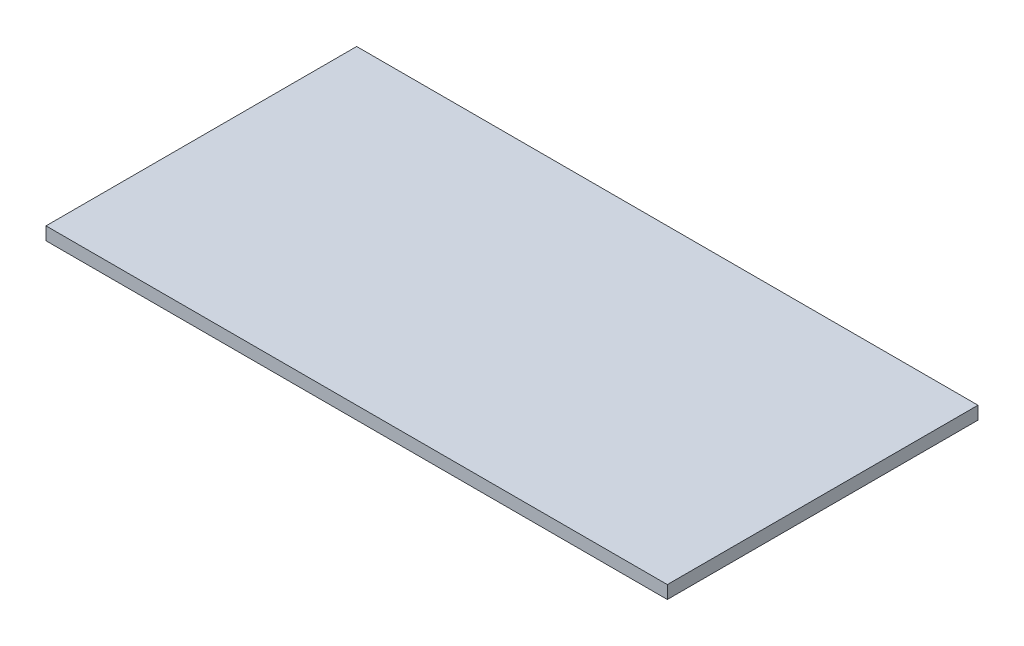
ISO-10303-21;
HEADER;
FILE_DESCRIPTION(('STEP AP214'),'2;1');
FILE_NAME('part.step','',(''),(''),'','','');
FILE_SCHEMA(('AUTOMOTIVE_DESIGN { 1 0 10303 214 1 1 1 1 }'));
ENDSEC;
DATA;
#1=APPLICATION_CONTEXT('core data for automotive mechanical design processes');
#2=APPLICATION_PROTOCOL_DEFINITION('international standard','automotive_design',2000,#1);
#3=PRODUCT_CONTEXT('',#1,'mechanical');
#4=PRODUCT('Part','Part','',(#3));
#5=PRODUCT_RELATED_PRODUCT_CATEGORY('part','',(#4));
#6=PRODUCT_DEFINITION_FORMATION('','',#4);
#7=PRODUCT_DEFINITION_CONTEXT('part definition',#1,'design');
#8=PRODUCT_DEFINITION('design','',#6,#7);
#9=PRODUCT_DEFINITION_SHAPE('','',#8);
#10=(LENGTH_UNIT() NAMED_UNIT(*) SI_UNIT(.MILLI.,.METRE.));
#11=(NAMED_UNIT(*) PLANE_ANGLE_UNIT() SI_UNIT($,.RADIAN.));
#12=(NAMED_UNIT(*) SI_UNIT($,.STERADIAN.) SOLID_ANGLE_UNIT());
#13=UNCERTAINTY_MEASURE_WITH_UNIT(LENGTH_MEASURE(1.E-05),#10,'distance_accuracy_value','');
#14=(GEOMETRIC_REPRESENTATION_CONTEXT(3) GLOBAL_UNCERTAINTY_ASSIGNED_CONTEXT((#13)) GLOBAL_UNIT_ASSIGNED_CONTEXT((#10,
#11,#12)) REPRESENTATION_CONTEXT('',''));
#15=CARTESIAN_POINT('',(0.,0.,0.));
#16=DIRECTION('',(0.,0.,1.));
#17=DIRECTION('',(1.,0.,0.));
#18=AXIS2_PLACEMENT_3D('',#15,#16,#17);
#19=CARTESIAN_POINT('',(-152.4,6.35,-76.2));
#20=DIRECTION('',(1.,0.,0.));
#21=DIRECTION('',(0.,0.,-1.));
#22=AXIS2_PLACEMENT_3D('',#19,#20,#21);
#23=PLANE('',#22);
#24=DIRECTION('',(0.,0.,1.));
#25=VECTOR('',#24,1.);
#26=CARTESIAN_POINT('',(-152.4,0.,-76.2));
#27=LINE('',#26,#25);
#28=CARTESIAN_POINT('',(-152.4,0.,-76.2));
#29=VERTEX_POINT('',#28);
#30=CARTESIAN_POINT('',(-152.4,0.,76.2));
#31=VERTEX_POINT('',#30);
#32=EDGE_CURVE('E95',#29,#31,#27,.T.);
#33=ORIENTED_EDGE('',*,*,#32,.T.);
#34=DIRECTION('',(0.,-1.,0.));
#35=VECTOR('',#34,1.);
#36=CARTESIAN_POINT('',(-152.4,6.35,76.2));
#37=LINE('',#36,#35);
#38=CARTESIAN_POINT('',(-152.4,6.35,76.2));
#39=VERTEX_POINT('',#38);
#40=EDGE_CURVE('E11',#39,#31,#37,.T.);
#41=ORIENTED_EDGE('',*,*,#40,.F.);
#42=DIRECTION('',(0.,0.,1.));
#43=VECTOR('',#42,1.);
#44=CARTESIAN_POINT('',(-152.4,6.35,-76.2));
#45=LINE('',#44,#43);
#46=CARTESIAN_POINT('',(-152.4,6.35,-76.2));
#47=VERTEX_POINT('',#46);
#48=EDGE_CURVE('E83',#47,#39,#45,.T.);
#49=ORIENTED_EDGE('',*,*,#48,.F.);
#50=DIRECTION('',(0.,-1.,0.));
#51=VECTOR('',#50,1.);
#52=CARTESIAN_POINT('',(-152.4,6.35,-76.2));
#53=LINE('',#52,#51);
#54=EDGE_CURVE('E91',#47,#29,#53,.T.);
#55=ORIENTED_EDGE('',*,*,#54,.T.);
#56=EDGE_LOOP('',(#33,#41,#49,#55));
#57=FACE_BOUND('',#56,.T.);
#58=ADVANCED_FACE('F32',(#57),#23,.F.);
#59=CARTESIAN_POINT('',(152.4,6.35,76.2));
#60=DIRECTION('',(0.,0.,-1.));
#61=DIRECTION('',(-1.,0.,0.));
#62=AXIS2_PLACEMENT_3D('',#59,#60,#61);
#63=PLANE('',#62);
#64=DIRECTION('',(1.,0.,0.));
#65=VECTOR('',#64,1.);
#66=CARTESIAN_POINT('',(152.4,0.,76.2));
#67=LINE('',#66,#65);
#68=CARTESIAN_POINT('',(152.4,0.,76.2));
#69=VERTEX_POINT('',#68);
#70=EDGE_CURVE('E87',#31,#69,#67,.T.);
#71=ORIENTED_EDGE('',*,*,#70,.T.);
#72=DIRECTION('',(0.,-1.,0.));
#73=VECTOR('',#72,1.);
#74=CARTESIAN_POINT('',(152.4,6.35,76.2));
#75=LINE('',#74,#73);
#76=CARTESIAN_POINT('',(152.4,6.35,76.2));
#77=VERTEX_POINT('',#76);
#78=EDGE_CURVE('E40',#77,#69,#75,.T.);
#79=ORIENTED_EDGE('',*,*,#78,.F.);
#80=DIRECTION('',(1.,0.,0.));
#81=VECTOR('',#80,1.);
#82=CARTESIAN_POINT('',(152.4,6.35,76.2));
#83=LINE('',#82,#81);
#84=EDGE_CURVE('E78',#39,#77,#83,.T.);
#85=ORIENTED_EDGE('',*,*,#84,.F.);
#86=ORIENTED_EDGE('',*,*,#40,.T.);
#87=EDGE_LOOP('',(#71,#79,#85,#86));
#88=FACE_BOUND('',#87,.T.);
#89=ADVANCED_FACE('F86',(#88),#63,.F.);
#90=CARTESIAN_POINT('',(152.4,6.35,-76.2));
#91=DIRECTION('',(-1.,0.,0.));
#92=DIRECTION('',(0.,0.,1.));
#93=AXIS2_PLACEMENT_3D('',#90,#91,#92);
#94=PLANE('',#93);
#95=DIRECTION('',(0.,0.,-1.));
#96=VECTOR('',#95,1.);
#97=CARTESIAN_POINT('',(152.4,0.,-76.2));
#98=LINE('',#97,#96);
#99=CARTESIAN_POINT('',(152.4,0.,-76.2));
#100=VERTEX_POINT('',#99);
#101=EDGE_CURVE('E65',#69,#100,#98,.T.);
#102=ORIENTED_EDGE('',*,*,#101,.T.);
#103=DIRECTION('',(0.,-1.,0.));
#104=VECTOR('',#103,1.);
#105=CARTESIAN_POINT('',(152.4,6.35,-76.2));
#106=LINE('',#105,#104);
#107=CARTESIAN_POINT('',(152.4,6.35,-76.2));
#108=VERTEX_POINT('',#107);
#109=EDGE_CURVE('E88',#108,#100,#106,.T.);
#110=ORIENTED_EDGE('',*,*,#109,.F.);
#111=DIRECTION('',(0.,0.,-1.));
#112=VECTOR('',#111,1.);
#113=CARTESIAN_POINT('',(152.4,6.35,-76.2));
#114=LINE('',#113,#112);
#115=EDGE_CURVE('E81',#77,#108,#114,.T.);
#116=ORIENTED_EDGE('',*,*,#115,.F.);
#117=ORIENTED_EDGE('',*,*,#78,.T.);
#118=EDGE_LOOP('',(#102,#110,#116,#117));
#119=FACE_BOUND('',#118,.T.);
#120=ADVANCED_FACE('F89',(#119),#94,.F.);
#121=CARTESIAN_POINT('',(152.4,6.35,-76.2));
#122=DIRECTION('',(0.,0.,1.));
#123=DIRECTION('',(1.,0.,0.));
#124=AXIS2_PLACEMENT_3D('',#121,#122,#123);
#125=PLANE('',#124);
#126=DIRECTION('',(-1.,0.,0.));
#127=VECTOR('',#126,1.);
#128=CARTESIAN_POINT('',(152.4,0.,-76.2));
#129=LINE('',#128,#127);
#130=EDGE_CURVE('E71',#100,#29,#129,.T.);
#131=ORIENTED_EDGE('',*,*,#130,.T.);
#132=ORIENTED_EDGE('',*,*,#54,.F.);
#133=DIRECTION('',(-1.,0.,0.));
#134=VECTOR('',#133,1.);
#135=CARTESIAN_POINT('',(152.4,6.35,-76.2));
#136=LINE('',#135,#134);
#137=EDGE_CURVE('E48',#108,#47,#136,.T.);
#138=ORIENTED_EDGE('',*,*,#137,.F.);
#139=ORIENTED_EDGE('',*,*,#109,.T.);
#140=EDGE_LOOP('',(#131,#132,#138,#139));
#141=FACE_BOUND('',#140,.T.);
#142=ADVANCED_FACE('F102',(#141),#125,.F.);
#143=CARTESIAN_POINT('',(0.,6.35,0.));
#144=DIRECTION('',(0.,-1.,0.));
#145=DIRECTION('',(0.,0.,-1.));
#146=AXIS2_PLACEMENT_3D('',#143,#144,#145);
#147=PLANE('',#146);
#148=ORIENTED_EDGE('',*,*,#48,.T.);
#149=ORIENTED_EDGE('',*,*,#84,.T.);
#150=ORIENTED_EDGE('',*,*,#115,.T.);
#151=ORIENTED_EDGE('',*,*,#137,.T.);
#152=EDGE_LOOP('',(#148,#149,#150,#151));
#153=FACE_BOUND('',#152,.T.);
#154=ADVANCED_FACE('F79',(#153),#147,.F.);
#155=CARTESIAN_POINT('',(0.,0.,0.));
#156=DIRECTION('',(0.,-1.,0.));
#157=DIRECTION('',(0.,0.,-1.));
#158=AXIS2_PLACEMENT_3D('',#155,#156,#157);
#159=PLANE('',#158);
#160=ORIENTED_EDGE('',*,*,#32,.F.);
#161=ORIENTED_EDGE('',*,*,#130,.F.);
#162=ORIENTED_EDGE('',*,*,#101,.F.);
#163=ORIENTED_EDGE('',*,*,#70,.F.);
#164=EDGE_LOOP('',(#160,#161,#162,#163));
#165=FACE_BOUND('',#164,.T.);
#166=ADVANCED_FACE('F105',(#165),#159,.T.);
#167=CLOSED_SHELL('',(#58,#89,#120,#142,#154,#166));
#168=MANIFOLD_SOLID_BREP('B2',#167);
#169=ADVANCED_BREP_SHAPE_REPRESENTATION('',(#18,#168),#14);
#170=SHAPE_DEFINITION_REPRESENTATION(#9,#169);
ENDSEC;
END-ISO-10303-21;
